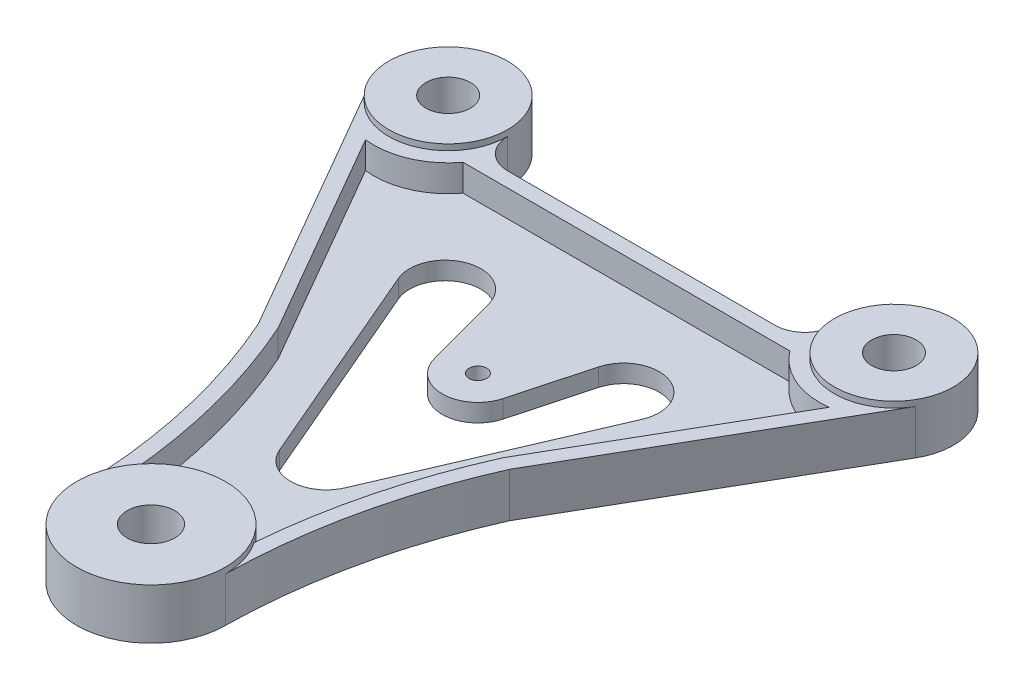
ISO-10303-21;
HEADER;
FILE_DESCRIPTION(('STEP AP214'),'2;1');
FILE_NAME('part.step','',(''),(''),'','','');
FILE_SCHEMA(('AUTOMOTIVE_DESIGN { 1 0 10303 214 1 1 1 1 }'));
ENDSEC;
DATA;
#1=APPLICATION_CONTEXT('core data for automotive mechanical design processes');
#2=APPLICATION_PROTOCOL_DEFINITION('international standard','automotive_design',2000,#1);
#3=PRODUCT_CONTEXT('',#1,'mechanical');
#4=PRODUCT('Part','Part','',(#3));
#5=PRODUCT_RELATED_PRODUCT_CATEGORY('part','',(#4));
#6=PRODUCT_DEFINITION_FORMATION('','',#4);
#7=PRODUCT_DEFINITION_CONTEXT('part definition',#1,'design');
#8=PRODUCT_DEFINITION('design','',#6,#7);
#9=PRODUCT_DEFINITION_SHAPE('','',#8);
#10=(LENGTH_UNIT() NAMED_UNIT(*) SI_UNIT(.MILLI.,.METRE.));
#11=(NAMED_UNIT(*) PLANE_ANGLE_UNIT() SI_UNIT($,.RADIAN.));
#12=(NAMED_UNIT(*) SI_UNIT($,.STERADIAN.) SOLID_ANGLE_UNIT());
#13=UNCERTAINTY_MEASURE_WITH_UNIT(LENGTH_MEASURE(1.E-05),#10,'distance_accuracy_value','');
#14=(GEOMETRIC_REPRESENTATION_CONTEXT(3) GLOBAL_UNCERTAINTY_ASSIGNED_CONTEXT((#13)) GLOBAL_UNIT_ASSIGNED_CONTEXT((#10,
#11,#12)) REPRESENTATION_CONTEXT('',''));
#15=CARTESIAN_POINT('',(0.,0.,0.));
#16=DIRECTION('',(0.,0.,1.));
#17=DIRECTION('',(1.,0.,0.));
#18=AXIS2_PLACEMENT_3D('',#15,#16,#17);
#19=CARTESIAN_POINT('',(-75.,17.,-175.));
#20=DIRECTION('',(0.,-1.,0.));
#21=DIRECTION('',(0.,0.,-1.));
#22=AXIS2_PLACEMENT_3D('',#19,#20,#21);
#23=CYLINDRICAL_SURFACE('',#22,20.);
#24=CARTESIAN_POINT('',(-75.,17.,-175.));
#25=DIRECTION('',(0.,1.,0.));
#26=DIRECTION('',(0.,0.,1.));
#27=AXIS2_PLACEMENT_3D('',#24,#25,#26);
#28=CIRCLE('',#27,20.);
#29=CARTESIAN_POINT('',(-75.,17.,-155.));
#30=VERTEX_POINT('',#29);
#31=EDGE_CURVE('E52',#30,#30,#28,.F.);
#32=ORIENTED_EDGE('',*,*,#31,.T.);
#33=EDGE_LOOP('',(#32));
#34=FACE_BOUND('',#33,.T.);
#35=CARTESIAN_POINT('',(-75.,15.,-175.));
#36=DIRECTION('',(0.,1.,0.));
#37=DIRECTION('',(0.,0.,1.));
#38=AXIS2_PLACEMENT_3D('',#35,#36,#37);
#39=CIRCLE('',#38,20.);
#40=CARTESIAN_POINT('',(-55.,15.,-175.));
#41=VERTEX_POINT('',#40);
#42=CARTESIAN_POINT('',(-92.3205080756888,15.,-165.));
#43=VERTEX_POINT('',#42);
#44=EDGE_CURVE('E397',#41,#43,#39,.F.);
#45=ORIENTED_EDGE('',*,*,#44,.F.);
#46=DIRECTION('',(0.,-1.,0.));
#47=VECTOR('',#46,1.);
#48=CARTESIAN_POINT('',(-55.,15.,-175.));
#49=LINE('',#48,#47);
#50=CARTESIAN_POINT('',(-55.,0.,-175.));
#51=VERTEX_POINT('',#50);
#52=EDGE_CURVE('E274',#41,#51,#49,.T.);
#53=ORIENTED_EDGE('',*,*,#52,.T.);
#54=CARTESIAN_POINT('',(-75.,0.,-175.));
#55=DIRECTION('',(0.,1.,0.));
#56=DIRECTION('',(0.,0.,1.));
#57=AXIS2_PLACEMENT_3D('',#54,#55,#56);
#58=CIRCLE('',#57,20.);
#59=CARTESIAN_POINT('',(-92.3205080756888,0.,-165.));
#60=VERTEX_POINT('',#59);
#61=EDGE_CURVE('E278',#60,#51,#58,.F.);
#62=ORIENTED_EDGE('',*,*,#61,.F.);
#63=DIRECTION('',(0.,-1.,0.));
#64=VECTOR('',#63,1.);
#65=CARTESIAN_POINT('',(-92.3205080756888,15.,-165.));
#66=LINE('',#65,#64);
#67=EDGE_CURVE('E271',#43,#60,#66,.T.);
#68=ORIENTED_EDGE('',*,*,#67,.F.);
#69=EDGE_LOOP('',(#45,#53,#62,#68));
#70=FACE_BOUND('',#69,.T.);
#71=ADVANCED_FACE('F43',(#34,#70),#23,.T.);
#72=CARTESIAN_POINT('',(-75.,17.,-175.));
#73=DIRECTION('',(0.,-1.,0.));
#74=DIRECTION('',(0.,0.,-1.));
#75=AXIS2_PLACEMENT_3D('',#72,#73,#74);
#76=CYLINDRICAL_SURFACE('',#75,7.5);
#77=CARTESIAN_POINT('',(-75.,17.,-175.));
#78=DIRECTION('',(0.,1.,0.));
#79=DIRECTION('',(0.,0.,1.));
#80=AXIS2_PLACEMENT_3D('',#77,#78,#79);
#81=CIRCLE('',#80,7.5);
#82=CARTESIAN_POINT('',(-75.,17.,-167.5));
#83=VERTEX_POINT('',#82);
#84=EDGE_CURVE('E11',#83,#83,#81,.F.);
#85=ORIENTED_EDGE('',*,*,#84,.F.);
#86=EDGE_LOOP('',(#85));
#87=FACE_BOUND('',#86,.T.);
#88=CARTESIAN_POINT('',(-75.,0.,-175.));
#89=DIRECTION('',(0.,1.,0.));
#90=DIRECTION('',(0.,0.,1.));
#91=AXIS2_PLACEMENT_3D('',#88,#89,#90);
#92=CIRCLE('',#91,7.5);
#93=CARTESIAN_POINT('',(-75.,0.,-167.5));
#94=VERTEX_POINT('',#93);
#95=EDGE_CURVE('E46',#94,#94,#92,.F.);
#96=ORIENTED_EDGE('',*,*,#95,.T.);
#97=EDGE_LOOP('',(#96));
#98=FACE_BOUND('',#97,.T.);
#99=ADVANCED_FACE('F288',(#87,#98),#76,.F.);
#100=CARTESIAN_POINT('',(0.,17.,0.));
#101=DIRECTION('',(0.,1.,0.));
#102=DIRECTION('',(0.,0.,1.));
#103=AXIS2_PLACEMENT_3D('',#100,#101,#102);
#104=PLANE('',#103);
#105=ORIENTED_EDGE('',*,*,#31,.F.);
#106=EDGE_LOOP('',(#105));
#107=FACE_BOUND('',#106,.T.);
#108=ORIENTED_EDGE('',*,*,#84,.T.);
#109=EDGE_LOOP('',(#108));
#110=FACE_BOUND('',#109,.T.);
#111=ADVANCED_FACE('F294',(#107,#110),#104,.T.);
#112=CARTESIAN_POINT('',(0.,0.,0.));
#113=DIRECTION('',(0.,1.,0.));
#114=DIRECTION('',(0.,0.,1.));
#115=AXIS2_PLACEMENT_3D('',#112,#113,#114);
#116=PLANE('',#115);
#117=CARTESIAN_POINT('',(0.,0.,0.));
#118=DIRECTION('',(0.,1.,0.));
#119=DIRECTION('',(0.,0.,1.));
#120=AXIS2_PLACEMENT_3D('',#117,#118,#119);
#121=CIRCLE('',#120,25.);
#122=CARTESIAN_POINT('',(-25.,0.,-2.94062734232381E-12));
#123=VERTEX_POINT('',#122);
#124=CARTESIAN_POINT('',(25.,0.,-2.94062734232381E-12));
#125=VERTEX_POINT('',#124);
#126=EDGE_CURVE('E370',#123,#125,#121,.T.);
#127=ORIENTED_EDGE('',*,*,#126,.F.);
#128=CARTESIAN_POINT('',(-224.976449544484,0.,3.06914117992598));
#129=DIRECTION('',(0.,1.,0.));
#130=DIRECTION('',(0.,0.,1.));
#131=AXIS2_PLACEMENT_3D('',#128,#129,#130);
#132=CIRCLE('',#131,200.);
#133=CARTESIAN_POINT('',(-42.320508075689,0.,-78.3974596215561));
#134=VERTEX_POINT('',#133);
#135=EDGE_CURVE('E459',#123,#134,#132,.T.);
#136=ORIENTED_EDGE('',*,*,#135,.T.);
#137=DIRECTION('',(0.499999999999998,0.,0.86602540378444));
#138=VECTOR('',#137,1.);
#139=CARTESIAN_POINT('',(2.20671475544918,0.,-1.27404735808329));
#140=LINE('',#139,#138);
#141=EDGE_CURVE('E68',#60,#134,#140,.T.);
#142=ORIENTED_EDGE('',*,*,#141,.F.);
#143=ORIENTED_EDGE('',*,*,#61,.T.);
#144=CARTESIAN_POINT('',(-45.,0.,-175.));
#145=DIRECTION('',(0.,1.,0.));
#146=DIRECTION('',(0.,0.,1.));
#147=AXIS2_PLACEMENT_3D('',#144,#145,#146);
#148=CIRCLE('',#147,10.);
#149=CARTESIAN_POINT('',(-45.,0.,-165.));
#150=VERTEX_POINT('',#149);
#151=EDGE_CURVE('E388',#150,#51,#148,.F.);
#152=ORIENTED_EDGE('',*,*,#151,.F.);
#153=DIRECTION('',(1.,0.,0.));
#154=VECTOR('',#153,1.);
#155=CARTESIAN_POINT('',(0.,0.,-165.));
#156=LINE('',#155,#154);
#157=CARTESIAN_POINT('',(45.,0.,-165.));
#158=VERTEX_POINT('',#157);
#159=EDGE_CURVE('E398',#150,#158,#156,.T.);
#160=ORIENTED_EDGE('',*,*,#159,.T.);
#161=CARTESIAN_POINT('',(45.,0.,-175.));
#162=DIRECTION('',(0.,1.,0.));
#163=DIRECTION('',(0.,0.,1.));
#164=AXIS2_PLACEMENT_3D('',#161,#162,#163);
#165=CIRCLE('',#164,10.);
#166=CARTESIAN_POINT('',(55.,0.,-175.));
#167=VERTEX_POINT('',#166);
#168=EDGE_CURVE('E470',#158,#167,#165,.T.);
#169=ORIENTED_EDGE('',*,*,#168,.T.);
#170=CARTESIAN_POINT('',(75.,0.,-175.));
#171=DIRECTION('',(0.,1.,0.));
#172=DIRECTION('',(0.,0.,1.));
#173=AXIS2_PLACEMENT_3D('',#170,#171,#172);
#174=CIRCLE('',#173,20.);
#175=CARTESIAN_POINT('',(92.3205080756888,0.,-165.));
#176=VERTEX_POINT('',#175);
#177=EDGE_CURVE('E384',#176,#167,#174,.T.);
#178=ORIENTED_EDGE('',*,*,#177,.F.);
#179=DIRECTION('',(-0.499999999999998,0.,0.86602540378444));
#180=VECTOR('',#179,1.);
#181=CARTESIAN_POINT('',(-2.20671475544918,0.,-1.27404735808329));
#182=LINE('',#181,#180);
#183=CARTESIAN_POINT('',(42.320508075689,0.,-78.3974596215561));
#184=VERTEX_POINT('',#183);
#185=EDGE_CURVE('E466',#176,#184,#182,.T.);
#186=ORIENTED_EDGE('',*,*,#185,.T.);
#187=CARTESIAN_POINT('',(224.976449544484,0.,3.06914117992598));
#188=DIRECTION('',(0.,1.,0.));
#189=DIRECTION('',(0.,0.,1.));
#190=AXIS2_PLACEMENT_3D('',#187,#188,#189);
#191=CIRCLE('',#190,200.);
#192=EDGE_CURVE('E462',#125,#184,#191,.F.);
#193=ORIENTED_EDGE('',*,*,#192,.F.);
#194=EDGE_LOOP('',(#127,#136,#142,#143,#152,#160,#169,#178,#186,#193));
#195=FACE_BOUND('',#194,.T.);
#196=ORIENTED_EDGE('',*,*,#95,.F.);
#197=EDGE_LOOP('',(#196));
#198=FACE_BOUND('',#197,.T.);
#199=CARTESIAN_POINT('',(75.,0.,-175.));
#200=DIRECTION('',(0.,1.,0.));
#201=DIRECTION('',(0.,0.,1.));
#202=AXIS2_PLACEMENT_3D('',#199,#200,#201);
#203=CIRCLE('',#202,7.5);
#204=CARTESIAN_POINT('',(75.,0.,-167.5));
#205=VERTEX_POINT('',#204);
#206=EDGE_CURVE('E299',#205,#205,#203,.T.);
#207=ORIENTED_EDGE('',*,*,#206,.T.);
#208=EDGE_LOOP('',(#207));
#209=FACE_BOUND('',#208,.T.);
#210=CARTESIAN_POINT('',(0.,0.,0.));
#211=DIRECTION('',(0.,1.,0.));
#212=DIRECTION('',(0.,0.,1.));
#213=AXIS2_PLACEMENT_3D('',#210,#211,#212);
#214=CIRCLE('',#213,8.);
#215=CARTESIAN_POINT('',(0.,0.,8.));
#216=VERTEX_POINT('',#215);
#217=EDGE_CURVE('E303',#216,#216,#214,.T.);
#218=ORIENTED_EDGE('',*,*,#217,.T.);
#219=EDGE_LOOP('',(#218));
#220=FACE_BOUND('',#219,.T.);
#221=CARTESIAN_POINT('',(0.,0.,-110.));
#222=DIRECTION('',(0.,1.,0.));
#223=DIRECTION('',(0.,0.,1.));
#224=AXIS2_PLACEMENT_3D('',#221,#222,#223);
#225=CIRCLE('',#224,3.);
#226=CARTESIAN_POINT('',(0.,0.,-107.));
#227=VERTEX_POINT('',#226);
#228=EDGE_CURVE('E307',#227,#227,#225,.T.);
#229=ORIENTED_EDGE('',*,*,#228,.T.);
#230=EDGE_LOOP('',(#229));
#231=FACE_BOUND('',#230,.T.);
#232=DIRECTION('',(-0.393919298579168,0.,-0.919145030018058));
#233=VECTOR('',#232,1.);
#234=CARTESIAN_POINT('',(10.3323286053005,0.,-4.42814083084309));
#235=LINE('',#234,#233);
#236=CARTESIAN_POINT('',(-11.0297403602167,0.,-54.27296841705));
#237=VERTEX_POINT('',#236);
#238=CARTESIAN_POINT('',(-41.0297403602167,0.,-124.27296841705));
#239=VERTEX_POINT('',#238);
#240=EDGE_CURVE('E311',#237,#239,#235,.T.);
#241=ORIENTED_EDGE('',*,*,#240,.F.);
#242=CARTESIAN_POINT('',(0.,0.,-59.));
#243=DIRECTION('',(0.,1.,0.));
#244=DIRECTION('',(0.,0.,1.));
#245=AXIS2_PLACEMENT_3D('',#242,#243,#244);
#246=CIRCLE('',#245,12.);
#247=CARTESIAN_POINT('',(11.0297403602167,0.,-54.27296841705));
#248=VERTEX_POINT('',#247);
#249=EDGE_CURVE('E314',#237,#248,#246,.T.);
#250=ORIENTED_EDGE('',*,*,#249,.T.);
#251=DIRECTION('',(0.393919298579168,0.,-0.919145030018058));
#252=VECTOR('',#251,1.);
#253=CARTESIAN_POINT('',(-10.3323286053005,0.,-4.42814083084309));
#254=LINE('',#253,#252);
#255=CARTESIAN_POINT('',(41.0297403602167,0.,-124.27296841705));
#256=VERTEX_POINT('',#255);
#257=EDGE_CURVE('E331',#248,#256,#254,.T.);
#258=ORIENTED_EDGE('',*,*,#257,.T.);
#259=CARTESIAN_POINT('',(30.,0.,-129.));
#260=DIRECTION('',(0.,1.,0.));
#261=DIRECTION('',(0.,0.,1.));
#262=AXIS2_PLACEMENT_3D('',#259,#260,#261);
#263=CIRCLE('',#262,12.);
#264=CARTESIAN_POINT('',(18.4160737020572,0.,-132.132515207278));
#265=VERTEX_POINT('',#264);
#266=EDGE_CURVE('E337',#256,#265,#263,.T.);
#267=ORIENTED_EDGE('',*,*,#266,.T.);
#268=DIRECTION('',(0.261042933939844,0.,-0.965327191495235));
#269=VECTOR('',#268,1.);
#270=CARTESIAN_POINT('',(-16.135176352838,0.,-4.36326026231327));
#271=LINE('',#270,#269);
#272=CARTESIAN_POINT('',(11.5839262979428,0.,-106.867484792722));
#273=VERTEX_POINT('',#272);
#274=EDGE_CURVE('E558',#273,#265,#271,.T.);
#275=ORIENTED_EDGE('',*,*,#274,.F.);
#276=CARTESIAN_POINT('',(0.,0.,-110.));
#277=DIRECTION('',(0.,1.,0.));
#278=DIRECTION('',(0.,0.,1.));
#279=AXIS2_PLACEMENT_3D('',#276,#277,#278);
#280=CIRCLE('',#279,12.);
#281=CARTESIAN_POINT('',(-11.5839262979428,0.,-106.867484792722));
#282=VERTEX_POINT('',#281);
#283=EDGE_CURVE('E555',#282,#273,#280,.T.);
#284=ORIENTED_EDGE('',*,*,#283,.F.);
#285=DIRECTION('',(-0.261042933939844,0.,-0.965327191495235));
#286=VECTOR('',#285,1.);
#287=CARTESIAN_POINT('',(16.135176352838,0.,-4.36326026231327));
#288=LINE('',#287,#286);
#289=CARTESIAN_POINT('',(-18.4160737020572,0.,-132.132515207278));
#290=VERTEX_POINT('',#289);
#291=EDGE_CURVE('E552',#282,#290,#288,.T.);
#292=ORIENTED_EDGE('',*,*,#291,.T.);
#293=CARTESIAN_POINT('',(-30.,0.,-129.));
#294=DIRECTION('',(0.,1.,0.));
#295=DIRECTION('',(0.,0.,1.));
#296=AXIS2_PLACEMENT_3D('',#293,#294,#295);
#297=CIRCLE('',#296,12.);
#298=EDGE_CURVE('E317',#239,#290,#297,.F.);
#299=ORIENTED_EDGE('',*,*,#298,.F.);
#300=EDGE_LOOP('',(#241,#250,#258,#267,#275,#284,#292,#299));
#301=FACE_BOUND('',#300,.T.);
#302=ADVANCED_FACE('F290',(#195,#198,#209,#220,#231,#301),#116,.F.);
#303=CARTESIAN_POINT('',(-45.,15.,-175.));
#304=DIRECTION('',(0.,-1.,0.));
#305=DIRECTION('',(0.,0.,-1.));
#306=AXIS2_PLACEMENT_3D('',#303,#304,#305);
#307=CYLINDRICAL_SURFACE('',#306,10.);
#308=ORIENTED_EDGE('',*,*,#151,.T.);
#309=ORIENTED_EDGE('',*,*,#52,.F.);
#310=CARTESIAN_POINT('',(-45.,15.,-175.));
#311=DIRECTION('',(0.,1.,0.));
#312=DIRECTION('',(0.,0.,1.));
#313=AXIS2_PLACEMENT_3D('',#310,#311,#312);
#314=CIRCLE('',#313,10.);
#315=CARTESIAN_POINT('',(-45.,15.,-165.));
#316=VERTEX_POINT('',#315);
#317=EDGE_CURVE('E394',#316,#41,#314,.F.);
#318=ORIENTED_EDGE('',*,*,#317,.F.);
#319=DIRECTION('',(0.,-1.,0.));
#320=VECTOR('',#319,1.);
#321=CARTESIAN_POINT('',(-45.,15.,-165.));
#322=LINE('',#321,#320);
#323=EDGE_CURVE('E454',#316,#150,#322,.T.);
#324=ORIENTED_EDGE('',*,*,#323,.T.);
#325=EDGE_LOOP('',(#308,#309,#318,#324));
#326=FACE_BOUND('',#325,.T.);
#327=ADVANCED_FACE('F293',(#326),#307,.F.);
#328=CARTESIAN_POINT('',(2.20671475544918,15.,-1.27404735808329));
#329=DIRECTION('',(0.86602540378444,0.,-0.499999999999998));
#330=DIRECTION('',(-0.499999999999998,0.,-0.86602540378444));
#331=AXIS2_PLACEMENT_3D('',#328,#329,#330);
#332=PLANE('',#331);
#333=ORIENTED_EDGE('',*,*,#141,.T.);
#334=DIRECTION('',(0.,-1.,0.));
#335=VECTOR('',#334,1.);
#336=CARTESIAN_POINT('',(-42.320508075689,15.,-78.3974596215561));
#337=LINE('',#336,#335);
#338=CARTESIAN_POINT('',(-42.320508075689,15.,-78.3974596215561));
#339=VERTEX_POINT('',#338);
#340=EDGE_CURVE('E268',#339,#134,#337,.T.);
#341=ORIENTED_EDGE('',*,*,#340,.F.);
#342=DIRECTION('',(0.499999999999998,0.,0.86602540378444));
#343=VECTOR('',#342,1.);
#344=CARTESIAN_POINT('',(2.20671475544918,15.,-1.27404735808329));
#345=LINE('',#344,#343);
#346=EDGE_CURVE('E401',#43,#339,#345,.T.);
#347=ORIENTED_EDGE('',*,*,#346,.F.);
#348=ORIENTED_EDGE('',*,*,#67,.T.);
#349=EDGE_LOOP('',(#333,#341,#347,#348));
#350=FACE_BOUND('',#349,.T.);
#351=ADVANCED_FACE('F618',(#350),#332,.F.);
#352=CARTESIAN_POINT('',(-224.976449544484,15.,3.06914117992598));
#353=DIRECTION('',(0.,-1.,0.));
#354=DIRECTION('',(0.,0.,-1.));
#355=AXIS2_PLACEMENT_3D('',#352,#353,#354);
#356=CYLINDRICAL_SURFACE('',#355,200.);
#357=ORIENTED_EDGE('',*,*,#135,.F.);
#358=DIRECTION('',(0.,-1.,0.));
#359=VECTOR('',#358,1.);
#360=CARTESIAN_POINT('',(-25.,15.,-2.94062734232381E-12));
#361=LINE('',#360,#359);
#362=CARTESIAN_POINT('',(-24.9999999999999,15.,6.27926530216705E-12));
#363=VERTEX_POINT('',#362);
#364=EDGE_CURVE('E264',#363,#123,#361,.T.);
#365=ORIENTED_EDGE('',*,*,#364,.F.);
#366=CARTESIAN_POINT('',(-224.976449544484,15.,3.06914117992598));
#367=DIRECTION('',(0.,1.,0.));
#368=DIRECTION('',(0.,0.,1.));
#369=AXIS2_PLACEMENT_3D('',#366,#367,#368);
#370=CIRCLE('',#369,200.);
#371=EDGE_CURVE('E404',#363,#339,#370,.T.);
#372=ORIENTED_EDGE('',*,*,#371,.T.);
#373=ORIENTED_EDGE('',*,*,#340,.T.);
#374=EDGE_LOOP('',(#357,#365,#372,#373));
#375=FACE_BOUND('',#374,.T.);
#376=ADVANCED_FACE('F621',(#375),#356,.F.);
#377=CARTESIAN_POINT('',(-224.976449544484,15.,3.06914117992598));
#378=DIRECTION('',(0.,-1.,0.));
#379=DIRECTION('',(0.,0.,-1.));
#380=AXIS2_PLACEMENT_3D('',#377,#378,#379);
#381=CYLINDRICAL_SURFACE('',#380,205.);
#382=DIRECTION('',(0.,-1.,0.));
#383=VECTOR('',#382,1.);
#384=CARTESIAN_POINT('',(-20.6909482523352,15.,-14.0315594435967));
#385=LINE('',#384,#383);
#386=CARTESIAN_POINT('',(-20.6909482523352,15.,-14.0315594435967));
#387=VERTEX_POINT('',#386);
#388=CARTESIAN_POINT('',(-20.6909482523352,6.,-14.0315594435967));
#389=VERTEX_POINT('',#388);
#390=EDGE_CURVE('E260',#387,#389,#385,.T.);
#391=ORIENTED_EDGE('',*,*,#390,.T.);
#392=CARTESIAN_POINT('',(-224.976449544484,6.,3.06914117992598));
#393=DIRECTION('',(0.,1.,0.));
#394=DIRECTION('',(0.,0.,1.));
#395=AXIS2_PLACEMENT_3D('',#392,#393,#394);
#396=CIRCLE('',#395,205.);
#397=CARTESIAN_POINT('',(-37.8609858470479,6.,-80.6733405440673));
#398=VERTEX_POINT('',#397);
#399=EDGE_CURVE('E60',#389,#398,#396,.T.);
#400=ORIENTED_EDGE('',*,*,#399,.T.);
#401=DIRECTION('',(0.,-1.,0.));
#402=VECTOR('',#401,1.);
#403=CARTESIAN_POINT('',(-37.8609858470479,15.,-80.6733405440673));
#404=LINE('',#403,#402);
#405=CARTESIAN_POINT('',(-37.8609858470479,15.,-80.6733405440673));
#406=VERTEX_POINT('',#405);
#407=EDGE_CURVE('E251',#406,#398,#404,.T.);
#408=ORIENTED_EDGE('',*,*,#407,.F.);
#409=CARTESIAN_POINT('',(-224.976449544484,15.,3.06914117992598));
#410=DIRECTION('',(0.,1.,0.));
#411=DIRECTION('',(0.,0.,1.));
#412=AXIS2_PLACEMENT_3D('',#409,#410,#411);
#413=CIRCLE('',#412,205.);
#414=EDGE_CURVE('E412',#387,#406,#413,.T.);
#415=ORIENTED_EDGE('',*,*,#414,.F.);
#416=EDGE_LOOP('',(#391,#400,#408,#415));
#417=FACE_BOUND('',#416,.T.);
#418=ADVANCED_FACE('F631',(#417),#381,.T.);
#419=CARTESIAN_POINT('',(6.53684177437186,15.,-3.77404735808359));
#420=DIRECTION('',(0.866025403784438,0.,-0.5));
#421=DIRECTION('',(-0.5,0.,-0.866025403784438));
#422=AXIS2_PLACEMENT_3D('',#419,#420,#421);
#423=PLANE('',#422);
#424=DIRECTION('',(0.5,0.,0.866025403784438));
#425=VECTOR('',#424,1.);
#426=CARTESIAN_POINT('',(6.53684177437186,6.,-3.77404735808359));
#427=LINE('',#426,#425);
#428=CARTESIAN_POINT('',(-77.9903810567666,6.,-150.179491924311));
#429=VERTEX_POINT('',#428);
#430=EDGE_CURVE('E241',#429,#398,#427,.T.);
#431=ORIENTED_EDGE('',*,*,#430,.F.);
#432=DIRECTION('',(0.,-1.,0.));
#433=VECTOR('',#432,1.);
#434=CARTESIAN_POINT('',(-77.9903810567666,15.,-150.179491924311));
#435=LINE('',#434,#433);
#436=CARTESIAN_POINT('',(-77.9903810567666,15.,-150.179491924311));
#437=VERTEX_POINT('',#436);
#438=EDGE_CURVE('E239',#437,#429,#435,.T.);
#439=ORIENTED_EDGE('',*,*,#438,.F.);
#440=DIRECTION('',(0.5,0.,0.866025403784438));
#441=VECTOR('',#440,1.);
#442=CARTESIAN_POINT('',(6.53684177437186,15.,-3.77404735808359));
#443=LINE('',#442,#441);
#444=EDGE_CURVE('E416',#437,#406,#443,.T.);
#445=ORIENTED_EDGE('',*,*,#444,.T.);
#446=ORIENTED_EDGE('',*,*,#407,.T.);
#447=EDGE_LOOP('',(#431,#439,#445,#446));
#448=FACE_BOUND('',#447,.T.);
#449=ADVANCED_FACE('F633',(#448),#423,.T.);
#450=CARTESIAN_POINT('',(-75.,15.,-175.));
#451=DIRECTION('',(0.,-1.,0.));
#452=DIRECTION('',(0.,0.,-1.));
#453=AXIS2_PLACEMENT_3D('',#450,#451,#452);
#454=CYLINDRICAL_SURFACE('',#453,25.);
#455=CARTESIAN_POINT('',(-75.,6.,-175.));
#456=DIRECTION('',(0.,1.,0.));
#457=DIRECTION('',(0.,0.,1.));
#458=AXIS2_PLACEMENT_3D('',#455,#456,#457);
#459=CIRCLE('',#458,25.);
#460=CARTESIAN_POINT('',(-55.,6.,-160.));
#461=VERTEX_POINT('',#460);
#462=EDGE_CURVE('E222',#461,#429,#459,.F.);
#463=ORIENTED_EDGE('',*,*,#462,.F.);
#464=DIRECTION('',(0.,-1.,0.));
#465=VECTOR('',#464,1.);
#466=CARTESIAN_POINT('',(-55.,15.,-160.));
#467=LINE('',#466,#465);
#468=CARTESIAN_POINT('',(-55.,15.,-160.));
#469=VERTEX_POINT('',#468);
#470=EDGE_CURVE('E237',#469,#461,#467,.T.);
#471=ORIENTED_EDGE('',*,*,#470,.F.);
#472=CARTESIAN_POINT('',(-75.,15.,-175.));
#473=DIRECTION('',(0.,1.,0.));
#474=DIRECTION('',(0.,0.,1.));
#475=AXIS2_PLACEMENT_3D('',#472,#473,#474);
#476=CIRCLE('',#475,25.);
#477=EDGE_CURVE('E420',#469,#437,#476,.F.);
#478=ORIENTED_EDGE('',*,*,#477,.T.);
#479=ORIENTED_EDGE('',*,*,#438,.T.);
#480=EDGE_LOOP('',(#463,#471,#478,#479));
#481=FACE_BOUND('',#480,.T.);
#482=ADVANCED_FACE('F235',(#481),#454,.T.);
#483=CARTESIAN_POINT('',(0.,15.,-160.));
#484=DIRECTION('',(0.,0.,-1.));
#485=DIRECTION('',(-1.,0.,0.));
#486=AXIS2_PLACEMENT_3D('',#483,#484,#485);
#487=PLANE('',#486);
#488=ORIENTED_EDGE('',*,*,#470,.T.);
#489=DIRECTION('',(1.,0.,0.));
#490=VECTOR('',#489,1.);
#491=CARTESIAN_POINT('',(0.,6.,-160.));
#492=LINE('',#491,#490);
#493=CARTESIAN_POINT('',(55.,6.,-160.));
#494=VERTEX_POINT('',#493);
#495=EDGE_CURVE('E218',#461,#494,#492,.T.);
#496=ORIENTED_EDGE('',*,*,#495,.T.);
#497=DIRECTION('',(0.,-1.,0.));
#498=VECTOR('',#497,1.);
#499=CARTESIAN_POINT('',(55.,15.,-160.));
#500=LINE('',#499,#498);
#501=CARTESIAN_POINT('',(55.,15.,-160.));
#502=VERTEX_POINT('',#501);
#503=EDGE_CURVE('E247',#502,#494,#500,.T.);
#504=ORIENTED_EDGE('',*,*,#503,.F.);
#505=DIRECTION('',(1.,0.,0.));
#506=VECTOR('',#505,1.);
#507=CARTESIAN_POINT('',(0.,15.,-160.));
#508=LINE('',#507,#506);
#509=EDGE_CURVE('E244',#469,#502,#508,.T.);
#510=ORIENTED_EDGE('',*,*,#509,.F.);
#511=EDGE_LOOP('',(#488,#496,#504,#510));
#512=FACE_BOUND('',#511,.T.);
#513=ADVANCED_FACE('F243',(#512),#487,.F.);
#514=CARTESIAN_POINT('',(75.,15.,-175.));
#515=DIRECTION('',(0.,-1.,0.));
#516=DIRECTION('',(0.,0.,-1.));
#517=AXIS2_PLACEMENT_3D('',#514,#515,#516);
#518=CYLINDRICAL_SURFACE('',#517,25.);
#519=ORIENTED_EDGE('',*,*,#503,.T.);
#520=CARTESIAN_POINT('',(75.,6.,-175.));
#521=DIRECTION('',(0.,1.,0.));
#522=DIRECTION('',(0.,0.,1.));
#523=AXIS2_PLACEMENT_3D('',#520,#521,#522);
#524=CIRCLE('',#523,25.);
#525=CARTESIAN_POINT('',(77.9903810567666,6.,-150.179491924311));
#526=VERTEX_POINT('',#525);
#527=EDGE_CURVE('E225',#494,#526,#524,.T.);
#528=ORIENTED_EDGE('',*,*,#527,.T.);
#529=DIRECTION('',(0.,-1.,0.));
#530=VECTOR('',#529,1.);
#531=CARTESIAN_POINT('',(77.9903810567666,15.,-150.179491924311));
#532=LINE('',#531,#530);
#533=CARTESIAN_POINT('',(77.9903810567666,15.,-150.179491924311));
#534=VERTEX_POINT('',#533);
#535=EDGE_CURVE('E253',#534,#526,#532,.T.);
#536=ORIENTED_EDGE('',*,*,#535,.F.);
#537=CARTESIAN_POINT('',(75.,15.,-175.));
#538=DIRECTION('',(0.,1.,0.));
#539=DIRECTION('',(0.,0.,1.));
#540=AXIS2_PLACEMENT_3D('',#537,#538,#539);
#541=CIRCLE('',#540,25.);
#542=EDGE_CURVE('E425',#502,#534,#541,.T.);
#543=ORIENTED_EDGE('',*,*,#542,.F.);
#544=EDGE_LOOP('',(#519,#528,#536,#543));
#545=FACE_BOUND('',#544,.T.);
#546=ADVANCED_FACE('F513',(#545),#518,.T.);
#547=CARTESIAN_POINT('',(-6.53684177437186,15.,-3.77404735808359));
#548=DIRECTION('',(0.866025403784438,0.,0.5));
#549=DIRECTION('',(0.5,0.,-0.866025403784438));
#550=AXIS2_PLACEMENT_3D('',#547,#548,#549);
#551=PLANE('',#550);
#552=ORIENTED_EDGE('',*,*,#535,.T.);
#553=DIRECTION('',(-0.5,0.,0.866025403784438));
#554=VECTOR('',#553,1.);
#555=CARTESIAN_POINT('',(-6.53684177437186,6.,-3.77404735808359));
#556=LINE('',#555,#554);
#557=CARTESIAN_POINT('',(37.8609858470479,6.,-80.6733405440673));
#558=VERTEX_POINT('',#557);
#559=EDGE_CURVE('E510',#526,#558,#556,.T.);
#560=ORIENTED_EDGE('',*,*,#559,.T.);
#561=DIRECTION('',(0.,-1.,0.));
#562=VECTOR('',#561,1.);
#563=CARTESIAN_POINT('',(37.8609858470479,15.,-80.6733405440673));
#564=LINE('',#563,#562);
#565=CARTESIAN_POINT('',(37.8609858470479,15.,-80.6733405440673));
#566=VERTEX_POINT('',#565);
#567=EDGE_CURVE('E499',#566,#558,#564,.T.);
#568=ORIENTED_EDGE('',*,*,#567,.F.);
#569=DIRECTION('',(-0.5,0.,0.866025403784438));
#570=VECTOR('',#569,1.);
#571=CARTESIAN_POINT('',(-6.53684177437186,15.,-3.77404735808359));
#572=LINE('',#571,#570);
#573=EDGE_CURVE('E428',#534,#566,#572,.T.);
#574=ORIENTED_EDGE('',*,*,#573,.F.);
#575=EDGE_LOOP('',(#552,#560,#568,#574));
#576=FACE_BOUND('',#575,.T.);
#577=ADVANCED_FACE('F508',(#576),#551,.F.);
#578=CARTESIAN_POINT('',(224.976449544484,15.,3.06914117992598));
#579=DIRECTION('',(0.,-1.,0.));
#580=DIRECTION('',(0.,0.,-1.));
#581=AXIS2_PLACEMENT_3D('',#578,#579,#580);
#582=CYLINDRICAL_SURFACE('',#581,205.);
#583=CARTESIAN_POINT('',(224.976449544484,6.,3.06914117992598));
#584=DIRECTION('',(0.,1.,0.));
#585=DIRECTION('',(0.,0.,1.));
#586=AXIS2_PLACEMENT_3D('',#583,#584,#585);
#587=CIRCLE('',#586,205.);
#588=CARTESIAN_POINT('',(20.6909482523352,6.,-14.0315594435967));
#589=VERTEX_POINT('',#588);
#590=EDGE_CURVE('E522',#589,#558,#587,.F.);
#591=ORIENTED_EDGE('',*,*,#590,.F.);
#592=DIRECTION('',(0.,-1.,0.));
#593=VECTOR('',#592,1.);
#594=CARTESIAN_POINT('',(20.6909482523352,15.,-14.0315594435967));
#595=LINE('',#594,#593);
#596=CARTESIAN_POINT('',(20.6909482523352,15.,-14.0315594435969));
#597=VERTEX_POINT('',#596);
#598=EDGE_CURVE('E495',#597,#589,#595,.T.);
#599=ORIENTED_EDGE('',*,*,#598,.F.);
#600=CARTESIAN_POINT('',(224.976449544484,15.,3.06914117992598));
#601=DIRECTION('',(0.,1.,0.));
#602=DIRECTION('',(0.,0.,1.));
#603=AXIS2_PLACEMENT_3D('',#600,#601,#602);
#604=CIRCLE('',#603,205.);
#605=EDGE_CURVE('E431',#597,#566,#604,.F.);
#606=ORIENTED_EDGE('',*,*,#605,.T.);
#607=ORIENTED_EDGE('',*,*,#567,.T.);
#608=EDGE_LOOP('',(#591,#599,#606,#607));
#609=FACE_BOUND('',#608,.T.);
#610=ADVANCED_FACE('F638',(#609),#582,.T.);
#611=CARTESIAN_POINT('',(224.976449544484,15.,3.06914117992598));
#612=DIRECTION('',(0.,-1.,0.));
#613=DIRECTION('',(0.,0.,-1.));
#614=AXIS2_PLACEMENT_3D('',#611,#612,#613);
#615=CYLINDRICAL_SURFACE('',#614,200.);
#616=ORIENTED_EDGE('',*,*,#192,.T.);
#617=DIRECTION('',(0.,-1.,0.));
#618=VECTOR('',#617,1.);
#619=CARTESIAN_POINT('',(42.320508075689,15.,-78.3974596215561));
#620=LINE('',#619,#618);
#621=CARTESIAN_POINT('',(42.320508075689,15.,-78.3974596215561));
#622=VERTEX_POINT('',#621);
#623=EDGE_CURVE('E489',#622,#184,#620,.T.);
#624=ORIENTED_EDGE('',*,*,#623,.F.);
#625=CARTESIAN_POINT('',(224.976449544484,15.,3.06914117992598));
#626=DIRECTION('',(0.,1.,0.));
#627=DIRECTION('',(0.,0.,1.));
#628=AXIS2_PLACEMENT_3D('',#625,#626,#627);
#629=CIRCLE('',#628,200.);
#630=CARTESIAN_POINT('',(25.,15.,-2.94062734232381E-12));
#631=VERTEX_POINT('',#630);
#632=EDGE_CURVE('E435',#631,#622,#629,.F.);
#633=ORIENTED_EDGE('',*,*,#632,.F.);
#634=DIRECTION('',(0.,-1.,0.));
#635=VECTOR('',#634,1.);
#636=CARTESIAN_POINT('',(25.,15.,-2.94062734232381E-12));
#637=LINE('',#636,#635);
#638=EDGE_CURVE('E492',#631,#125,#637,.T.);
#639=ORIENTED_EDGE('',*,*,#638,.T.);
#640=EDGE_LOOP('',(#616,#624,#633,#639));
#641=FACE_BOUND('',#640,.T.);
#642=ADVANCED_FACE('F645',(#641),#615,.F.);
#643=CARTESIAN_POINT('',(-2.20671475544918,15.,-1.27404735808329));
#644=DIRECTION('',(0.86602540378444,0.,0.499999999999998));
#645=DIRECTION('',(0.499999999999998,0.,-0.86602540378444));
#646=AXIS2_PLACEMENT_3D('',#643,#644,#645);
#647=PLANE('',#646);
#648=ORIENTED_EDGE('',*,*,#185,.F.);
#649=DIRECTION('',(0.,-1.,0.));
#650=VECTOR('',#649,1.);
#651=CARTESIAN_POINT('',(92.3205080756888,15.,-165.));
#652=LINE('',#651,#650);
#653=CARTESIAN_POINT('',(92.3205080756888,15.,-165.));
#654=VERTEX_POINT('',#653);
#655=EDGE_CURVE('E485',#654,#176,#652,.T.);
#656=ORIENTED_EDGE('',*,*,#655,.F.);
#657=DIRECTION('',(-0.499999999999998,0.,0.86602540378444));
#658=VECTOR('',#657,1.);
#659=CARTESIAN_POINT('',(-2.20671475544918,15.,-1.27404735808329));
#660=LINE('',#659,#658);
#661=EDGE_CURVE('E438',#654,#622,#660,.T.);
#662=ORIENTED_EDGE('',*,*,#661,.T.);
#663=ORIENTED_EDGE('',*,*,#623,.T.);
#664=EDGE_LOOP('',(#648,#656,#662,#663));
#665=FACE_BOUND('',#664,.T.);
#666=ADVANCED_FACE('F648',(#665),#647,.T.);
#667=CARTESIAN_POINT('',(45.,15.,-175.));
#668=DIRECTION('',(0.,-1.,0.));
#669=DIRECTION('',(0.,0.,-1.));
#670=AXIS2_PLACEMENT_3D('',#667,#668,#669);
#671=CYLINDRICAL_SURFACE('',#670,10.);
#672=ORIENTED_EDGE('',*,*,#168,.F.);
#673=DIRECTION('',(0.,-1.,0.));
#674=VECTOR('',#673,1.);
#675=CARTESIAN_POINT('',(45.,15.,-165.));
#676=LINE('',#675,#674);
#677=CARTESIAN_POINT('',(45.,15.,-165.));
#678=VERTEX_POINT('',#677);
#679=EDGE_CURVE('E479',#678,#158,#676,.T.);
#680=ORIENTED_EDGE('',*,*,#679,.F.);
#681=CARTESIAN_POINT('',(45.,15.,-175.));
#682=DIRECTION('',(0.,1.,0.));
#683=DIRECTION('',(0.,0.,1.));
#684=AXIS2_PLACEMENT_3D('',#681,#682,#683);
#685=CIRCLE('',#684,10.);
#686=CARTESIAN_POINT('',(55.,15.,-175.));
#687=VERTEX_POINT('',#686);
#688=EDGE_CURVE('E446',#678,#687,#685,.T.);
#689=ORIENTED_EDGE('',*,*,#688,.T.);
#690=DIRECTION('',(0.,-1.,0.));
#691=VECTOR('',#690,1.);
#692=CARTESIAN_POINT('',(55.,15.,-175.));
#693=LINE('',#692,#691);
#694=EDGE_CURVE('E482',#687,#167,#693,.T.);
#695=ORIENTED_EDGE('',*,*,#694,.T.);
#696=EDGE_LOOP('',(#672,#680,#689,#695));
#697=FACE_BOUND('',#696,.T.);
#698=ADVANCED_FACE('F657',(#697),#671,.F.);
#699=CARTESIAN_POINT('',(0.,15.,-165.));
#700=DIRECTION('',(0.,0.,-1.));
#701=DIRECTION('',(-1.,0.,0.));
#702=AXIS2_PLACEMENT_3D('',#699,#700,#701);
#703=PLANE('',#702);
#704=ORIENTED_EDGE('',*,*,#159,.F.);
#705=ORIENTED_EDGE('',*,*,#323,.F.);
#706=DIRECTION('',(1.,0.,0.));
#707=VECTOR('',#706,1.);
#708=CARTESIAN_POINT('',(0.,15.,-165.));
#709=LINE('',#708,#707);
#710=EDGE_CURVE('E450',#316,#678,#709,.T.);
#711=ORIENTED_EDGE('',*,*,#710,.T.);
#712=ORIENTED_EDGE('',*,*,#679,.T.);
#713=EDGE_LOOP('',(#704,#705,#711,#712));
#714=FACE_BOUND('',#713,.T.);
#715=ADVANCED_FACE('F660',(#714),#703,.T.);
#716=CARTESIAN_POINT('',(0.,15.,0.));
#717=DIRECTION('',(0.,1.,0.));
#718=DIRECTION('',(0.,0.,1.));
#719=AXIS2_PLACEMENT_3D('',#716,#717,#718);
#720=PLANE('',#719);
#721=ORIENTED_EDGE('',*,*,#317,.T.);
#722=ORIENTED_EDGE('',*,*,#44,.T.);
#723=ORIENTED_EDGE('',*,*,#346,.T.);
#724=ORIENTED_EDGE('',*,*,#371,.F.);
#725=CARTESIAN_POINT('',(0.,15.,0.));
#726=DIRECTION('',(0.,1.,0.));
#727=DIRECTION('',(0.,0.,1.));
#728=AXIS2_PLACEMENT_3D('',#725,#726,#727);
#729=CIRCLE('',#728,25.);
#730=EDGE_CURVE('E408',#387,#363,#729,.T.);
#731=ORIENTED_EDGE('',*,*,#730,.F.);
#732=ORIENTED_EDGE('',*,*,#414,.T.);
#733=ORIENTED_EDGE('',*,*,#444,.F.);
#734=ORIENTED_EDGE('',*,*,#477,.F.);
#735=ORIENTED_EDGE('',*,*,#509,.T.);
#736=ORIENTED_EDGE('',*,*,#542,.T.);
#737=ORIENTED_EDGE('',*,*,#573,.T.);
#738=ORIENTED_EDGE('',*,*,#605,.F.);
#739=EDGE_CURVE('E413',#631,#597,#729,.T.);
#740=ORIENTED_EDGE('',*,*,#739,.F.);
#741=ORIENTED_EDGE('',*,*,#632,.T.);
#742=ORIENTED_EDGE('',*,*,#661,.F.);
#743=CARTESIAN_POINT('',(75.,15.,-175.));
#744=DIRECTION('',(0.,1.,0.));
#745=DIRECTION('',(0.,0.,1.));
#746=AXIS2_PLACEMENT_3D('',#743,#744,#745);
#747=CIRCLE('',#746,20.);
#748=EDGE_CURVE('E442',#687,#654,#747,.T.);
#749=ORIENTED_EDGE('',*,*,#748,.F.);
#750=ORIENTED_EDGE('',*,*,#688,.F.);
#751=ORIENTED_EDGE('',*,*,#710,.F.);
#752=EDGE_LOOP('',(#721,#722,#723,#724,#731,#732,#733,#734,#735,#736,#737,#738,#740,#741,#742,
#749,#750,#751));
#753=FACE_BOUND('',#752,.T.);
#754=ADVANCED_FACE('F613',(#753),#720,.T.);
#755=CARTESIAN_POINT('',(75.,17.,-175.));
#756=DIRECTION('',(0.,-1.,0.));
#757=DIRECTION('',(0.,0.,-1.));
#758=AXIS2_PLACEMENT_3D('',#755,#756,#757);
#759=CYLINDRICAL_SURFACE('',#758,7.5);
#760=CARTESIAN_POINT('',(75.,17.,-175.));
#761=DIRECTION('',(0.,1.,0.));
#762=DIRECTION('',(0.,0.,1.));
#763=AXIS2_PLACEMENT_3D('',#760,#761,#762);
#764=CIRCLE('',#763,7.5);
#765=CARTESIAN_POINT('',(75.,17.,-167.5));
#766=VERTEX_POINT('',#765);
#767=EDGE_CURVE('E379',#766,#766,#764,.T.);
#768=ORIENTED_EDGE('',*,*,#767,.T.);
#769=EDGE_LOOP('',(#768));
#770=FACE_BOUND('',#769,.T.);
#771=ORIENTED_EDGE('',*,*,#206,.F.);
#772=EDGE_LOOP('',(#771));
#773=FACE_BOUND('',#772,.T.);
#774=ADVANCED_FACE('F801',(#770,#773),#759,.F.);
#775=CARTESIAN_POINT('',(75.,17.,-175.));
#776=DIRECTION('',(0.,-1.,0.));
#777=DIRECTION('',(0.,0.,-1.));
#778=AXIS2_PLACEMENT_3D('',#775,#776,#777);
#779=CYLINDRICAL_SURFACE('',#778,20.);
#780=ORIENTED_EDGE('',*,*,#655,.T.);
#781=ORIENTED_EDGE('',*,*,#177,.T.);
#782=ORIENTED_EDGE('',*,*,#694,.F.);
#783=ORIENTED_EDGE('',*,*,#748,.T.);
#784=EDGE_LOOP('',(#780,#781,#782,#783));
#785=FACE_BOUND('',#784,.T.);
#786=CARTESIAN_POINT('',(75.,17.,-175.));
#787=DIRECTION('',(0.,1.,0.));
#788=DIRECTION('',(0.,0.,1.));
#789=AXIS2_PLACEMENT_3D('',#786,#787,#788);
#790=CIRCLE('',#789,20.);
#791=CARTESIAN_POINT('',(75.,17.,-155.));
#792=VERTEX_POINT('',#791);
#793=EDGE_CURVE('E383',#792,#792,#790,.T.);
#794=ORIENTED_EDGE('',*,*,#793,.F.);
#795=EDGE_LOOP('',(#794));
#796=FACE_BOUND('',#795,.T.);
#797=ADVANCED_FACE('F652',(#785,#796),#779,.T.);
#798=CARTESIAN_POINT('',(0.,17.,0.));
#799=DIRECTION('',(0.,1.,0.));
#800=DIRECTION('',(0.,0.,1.));
#801=AXIS2_PLACEMENT_3D('',#798,#799,#800);
#802=PLANE('',#801);
#803=ORIENTED_EDGE('',*,*,#767,.F.);
#804=EDGE_LOOP('',(#803));
#805=FACE_BOUND('',#804,.T.);
#806=ORIENTED_EDGE('',*,*,#793,.T.);
#807=EDGE_LOOP('',(#806));
#808=FACE_BOUND('',#807,.T.);
#809=ADVANCED_FACE('F885',(#805,#808),#802,.T.);
#810=CARTESIAN_POINT('',(0.,17.,0.));
#811=DIRECTION('',(0.,-1.,0.));
#812=DIRECTION('',(0.,0.,-1.));
#813=AXIS2_PLACEMENT_3D('',#810,#811,#812);
#814=CYLINDRICAL_SURFACE('',#813,8.);
#815=CARTESIAN_POINT('',(0.,17.,0.));
#816=DIRECTION('',(0.,1.,0.));
#817=DIRECTION('',(0.,0.,1.));
#818=AXIS2_PLACEMENT_3D('',#815,#816,#817);
#819=CIRCLE('',#818,8.);
#820=CARTESIAN_POINT('',(0.,17.,8.));
#821=VERTEX_POINT('',#820);
#822=EDGE_CURVE('E365',#821,#821,#819,.T.);
#823=ORIENTED_EDGE('',*,*,#822,.T.);
#824=EDGE_LOOP('',(#823));
#825=FACE_BOUND('',#824,.T.);
#826=ORIENTED_EDGE('',*,*,#217,.F.);
#827=EDGE_LOOP('',(#826));
#828=FACE_BOUND('',#827,.T.);
#829=ADVANCED_FACE('F698',(#825,#828),#814,.F.);
#830=CARTESIAN_POINT('',(0.,17.,0.));
#831=DIRECTION('',(0.,-1.,0.));
#832=DIRECTION('',(0.,0.,-1.));
#833=AXIS2_PLACEMENT_3D('',#830,#831,#832);
#834=CYLINDRICAL_SURFACE('',#833,25.);
#835=ORIENTED_EDGE('',*,*,#598,.T.);
#836=CARTESIAN_POINT('',(0.,6.,0.));
#837=DIRECTION('',(0.,1.,0.));
#838=DIRECTION('',(0.,0.,1.));
#839=AXIS2_PLACEMENT_3D('',#836,#837,#838);
#840=CIRCLE('',#839,25.);
#841=EDGE_CURVE('E629',#589,#389,#840,.T.);
#842=ORIENTED_EDGE('',*,*,#841,.T.);
#843=ORIENTED_EDGE('',*,*,#390,.F.);
#844=ORIENTED_EDGE('',*,*,#730,.T.);
#845=ORIENTED_EDGE('',*,*,#364,.T.);
#846=ORIENTED_EDGE('',*,*,#126,.T.);
#847=ORIENTED_EDGE('',*,*,#638,.F.);
#848=ORIENTED_EDGE('',*,*,#739,.T.);
#849=EDGE_LOOP('',(#835,#842,#843,#844,#845,#846,#847,#848));
#850=FACE_BOUND('',#849,.T.);
#851=CARTESIAN_POINT('',(0.,17.,0.));
#852=DIRECTION('',(0.,1.,0.));
#853=DIRECTION('',(0.,0.,1.));
#854=AXIS2_PLACEMENT_3D('',#851,#852,#853);
#855=CIRCLE('',#854,25.);
#856=CARTESIAN_POINT('',(0.,17.,25.));
#857=VERTEX_POINT('',#856);
#858=EDGE_CURVE('E369',#857,#857,#855,.T.);
#859=ORIENTED_EDGE('',*,*,#858,.F.);
#860=EDGE_LOOP('',(#859));
#861=FACE_BOUND('',#860,.T.);
#862=ADVANCED_FACE('F627',(#850,#861),#834,.T.);
#863=CARTESIAN_POINT('',(0.,17.,0.));
#864=DIRECTION('',(0.,1.,0.));
#865=DIRECTION('',(0.,0.,1.));
#866=AXIS2_PLACEMENT_3D('',#863,#864,#865);
#867=PLANE('',#866);
#868=ORIENTED_EDGE('',*,*,#822,.F.);
#869=EDGE_LOOP('',(#868));
#870=FACE_BOUND('',#869,.T.);
#871=ORIENTED_EDGE('',*,*,#858,.T.);
#872=EDGE_LOOP('',(#871));
#873=FACE_BOUND('',#872,.T.);
#874=ADVANCED_FACE('F697',(#870,#873),#867,.T.);
#875=CARTESIAN_POINT('',(10.3323286053005,6.,-4.42814083084309));
#876=DIRECTION('',(-0.919145030018058,0.,0.393919298579168));
#877=DIRECTION('',(0.393919298579168,0.,0.919145030018058));
#878=AXIS2_PLACEMENT_3D('',#875,#876,#877);
#879=PLANE('',#878);
#880=ORIENTED_EDGE('',*,*,#240,.T.);
#881=DIRECTION('',(0.,-1.,0.));
#882=VECTOR('',#881,1.);
#883=CARTESIAN_POINT('',(-41.0297403602167,6.,-124.27296841705));
#884=LINE('',#883,#882);
#885=CARTESIAN_POINT('',(-41.0297403602167,6.,-124.27296841705));
#886=VERTEX_POINT('',#885);
#887=EDGE_CURVE('E362',#886,#239,#884,.T.);
#888=ORIENTED_EDGE('',*,*,#887,.F.);
#889=DIRECTION('',(-0.393919298579168,0.,-0.919145030018058));
#890=VECTOR('',#889,1.);
#891=CARTESIAN_POINT('',(10.3323286053005,6.,-4.42814083084309));
#892=LINE('',#891,#890);
#893=CARTESIAN_POINT('',(-11.0297403602167,6.,-54.27296841705));
#894=VERTEX_POINT('',#893);
#895=EDGE_CURVE('E515',#894,#886,#892,.T.);
#896=ORIENTED_EDGE('',*,*,#895,.F.);
#897=DIRECTION('',(0.,-1.,0.));
#898=VECTOR('',#897,1.);
#899=CARTESIAN_POINT('',(-11.0297403602167,6.,-54.27296841705));
#900=LINE('',#899,#898);
#901=EDGE_CURVE('E326',#894,#237,#900,.T.);
#902=ORIENTED_EDGE('',*,*,#901,.T.);
#903=EDGE_LOOP('',(#880,#888,#896,#902));
#904=FACE_BOUND('',#903,.T.);
#905=ADVANCED_FACE('F584',(#904),#879,.F.);
#906=CARTESIAN_POINT('',(-30.,6.,-129.));
#907=DIRECTION('',(0.,-1.,0.));
#908=DIRECTION('',(0.,0.,-1.));
#909=AXIS2_PLACEMENT_3D('',#906,#907,#908);
#910=CYLINDRICAL_SURFACE('',#909,12.);
#911=ORIENTED_EDGE('',*,*,#298,.T.);
#912=DIRECTION('',(0.,-1.,0.));
#913=VECTOR('',#912,1.);
#914=CARTESIAN_POINT('',(-18.4160737020572,6.,-132.132515207278));
#915=LINE('',#914,#913);
#916=CARTESIAN_POINT('',(-18.4160737020572,6.,-132.132515207278));
#917=VERTEX_POINT('',#916);
#918=EDGE_CURVE('E359',#917,#290,#915,.T.);
#919=ORIENTED_EDGE('',*,*,#918,.F.);
#920=CARTESIAN_POINT('',(-30.,6.,-129.));
#921=DIRECTION('',(0.,1.,0.));
#922=DIRECTION('',(0.,0.,1.));
#923=AXIS2_PLACEMENT_3D('',#920,#921,#922);
#924=CIRCLE('',#923,12.);
#925=EDGE_CURVE('E520',#886,#917,#924,.F.);
#926=ORIENTED_EDGE('',*,*,#925,.F.);
#927=ORIENTED_EDGE('',*,*,#887,.T.);
#928=EDGE_LOOP('',(#911,#919,#926,#927));
#929=FACE_BOUND('',#928,.T.);
#930=ADVANCED_FACE('F583',(#929),#910,.F.);
#931=CARTESIAN_POINT('',(16.135176352838,6.,-4.36326026231327));
#932=DIRECTION('',(-0.965327191495235,0.,0.261042933939844));
#933=DIRECTION('',(0.261042933939844,0.,0.965327191495235));
#934=AXIS2_PLACEMENT_3D('',#931,#932,#933);
#935=PLANE('',#934);
#936=ORIENTED_EDGE('',*,*,#291,.F.);
#937=DIRECTION('',(0.,-1.,0.));
#938=VECTOR('',#937,1.);
#939=CARTESIAN_POINT('',(-11.5839262979428,6.,-106.867484792722));
#940=LINE('',#939,#938);
#941=CARTESIAN_POINT('',(-11.5839262979428,6.,-106.867484792722));
#942=VERTEX_POINT('',#941);
#943=EDGE_CURVE('E356',#942,#282,#940,.T.);
#944=ORIENTED_EDGE('',*,*,#943,.F.);
#945=DIRECTION('',(-0.261042933939844,0.,-0.965327191495235));
#946=VECTOR('',#945,1.);
#947=CARTESIAN_POINT('',(16.135176352838,6.,-4.36326026231327));
#948=LINE('',#947,#946);
#949=EDGE_CURVE('E528',#942,#917,#948,.T.);
#950=ORIENTED_EDGE('',*,*,#949,.T.);
#951=ORIENTED_EDGE('',*,*,#918,.T.);
#952=EDGE_LOOP('',(#936,#944,#950,#951));
#953=FACE_BOUND('',#952,.T.);
#954=ADVANCED_FACE('F580',(#953),#935,.T.);
#955=CARTESIAN_POINT('',(0.,6.,-110.));
#956=DIRECTION('',(0.,-1.,0.));
#957=DIRECTION('',(0.,0.,-1.));
#958=AXIS2_PLACEMENT_3D('',#955,#956,#957);
#959=CYLINDRICAL_SURFACE('',#958,12.);
#960=ORIENTED_EDGE('',*,*,#283,.T.);
#961=DIRECTION('',(0.,-1.,0.));
#962=VECTOR('',#961,1.);
#963=CARTESIAN_POINT('',(11.5839262979428,6.,-106.867484792722));
#964=LINE('',#963,#962);
#965=CARTESIAN_POINT('',(11.5839262979428,6.,-106.867484792722));
#966=VERTEX_POINT('',#965);
#967=EDGE_CURVE('E352',#966,#273,#964,.T.);
#968=ORIENTED_EDGE('',*,*,#967,.F.);
#969=CARTESIAN_POINT('',(0.,6.,-110.));
#970=DIRECTION('',(0.,1.,0.));
#971=DIRECTION('',(0.,0.,1.));
#972=AXIS2_PLACEMENT_3D('',#969,#970,#971);
#973=CIRCLE('',#972,12.);
#974=EDGE_CURVE('E532',#942,#966,#973,.T.);
#975=ORIENTED_EDGE('',*,*,#974,.F.);
#976=ORIENTED_EDGE('',*,*,#943,.T.);
#977=EDGE_LOOP('',(#960,#968,#975,#976));
#978=FACE_BOUND('',#977,.T.);
#979=ADVANCED_FACE('F576',(#978),#959,.T.);
#980=CARTESIAN_POINT('',(-16.135176352838,6.,-4.36326026231327));
#981=DIRECTION('',(-0.965327191495235,0.,-0.261042933939844));
#982=DIRECTION('',(-0.261042933939844,0.,0.965327191495235));
#983=AXIS2_PLACEMENT_3D('',#980,#981,#982);
#984=PLANE('',#983);
#985=ORIENTED_EDGE('',*,*,#274,.T.);
#986=DIRECTION('',(0.,-1.,0.));
#987=VECTOR('',#986,1.);
#988=CARTESIAN_POINT('',(18.4160737020572,6.,-132.132515207278));
#989=LINE('',#988,#987);
#990=CARTESIAN_POINT('',(18.4160737020572,6.,-132.132515207278));
#991=VERTEX_POINT('',#990);
#992=EDGE_CURVE('E349',#991,#265,#989,.T.);
#993=ORIENTED_EDGE('',*,*,#992,.F.);
#994=DIRECTION('',(0.261042933939844,0.,-0.965327191495235));
#995=VECTOR('',#994,1.);
#996=CARTESIAN_POINT('',(-16.135176352838,6.,-4.36326026231327));
#997=LINE('',#996,#995);
#998=EDGE_CURVE('E535',#966,#991,#997,.T.);
#999=ORIENTED_EDGE('',*,*,#998,.F.);
#1000=ORIENTED_EDGE('',*,*,#967,.T.);
#1001=EDGE_LOOP('',(#985,#993,#999,#1000));
#1002=FACE_BOUND('',#1001,.T.);
#1003=ADVANCED_FACE('F572',(#1002),#984,.F.);
#1004=CARTESIAN_POINT('',(30.,6.,-129.));
#1005=DIRECTION('',(0.,-1.,0.));
#1006=DIRECTION('',(0.,0.,-1.));
#1007=AXIS2_PLACEMENT_3D('',#1004,#1005,#1006);
#1008=CYLINDRICAL_SURFACE('',#1007,12.);
#1009=ORIENTED_EDGE('',*,*,#266,.F.);
#1010=DIRECTION('',(0.,-1.,0.));
#1011=VECTOR('',#1010,1.);
#1012=CARTESIAN_POINT('',(41.0297403602167,6.,-124.27296841705));
#1013=LINE('',#1012,#1011);
#1014=CARTESIAN_POINT('',(41.0297403602167,6.,-124.27296841705));
#1015=VERTEX_POINT('',#1014);
#1016=EDGE_CURVE('E346',#1015,#256,#1013,.T.);
#1017=ORIENTED_EDGE('',*,*,#1016,.F.);
#1018=CARTESIAN_POINT('',(30.,6.,-129.));
#1019=DIRECTION('',(0.,1.,0.));
#1020=DIRECTION('',(0.,0.,1.));
#1021=AXIS2_PLACEMENT_3D('',#1018,#1019,#1020);
#1022=CIRCLE('',#1021,12.);
#1023=EDGE_CURVE('E538',#1015,#991,#1022,.T.);
#1024=ORIENTED_EDGE('',*,*,#1023,.T.);
#1025=ORIENTED_EDGE('',*,*,#992,.T.);
#1026=EDGE_LOOP('',(#1009,#1017,#1024,#1025));
#1027=FACE_BOUND('',#1026,.T.);
#1028=ADVANCED_FACE('F567',(#1027),#1008,.F.);
#1029=CARTESIAN_POINT('',(-10.3323286053005,6.,-4.42814083084309));
#1030=DIRECTION('',(-0.919145030018058,0.,-0.393919298579168));
#1031=DIRECTION('',(-0.393919298579168,0.,0.919145030018058));
#1032=AXIS2_PLACEMENT_3D('',#1029,#1030,#1031);
#1033=PLANE('',#1032);
#1034=ORIENTED_EDGE('',*,*,#257,.F.);
#1035=DIRECTION('',(0.,-1.,0.));
#1036=VECTOR('',#1035,1.);
#1037=CARTESIAN_POINT('',(11.0297403602167,6.,-54.27296841705));
#1038=LINE('',#1037,#1036);
#1039=CARTESIAN_POINT('',(11.0297403602167,6.,-54.27296841705));
#1040=VERTEX_POINT('',#1039);
#1041=EDGE_CURVE('E328',#1040,#248,#1038,.T.);
#1042=ORIENTED_EDGE('',*,*,#1041,.F.);
#1043=DIRECTION('',(0.393919298579168,0.,-0.919145030018058));
#1044=VECTOR('',#1043,1.);
#1045=CARTESIAN_POINT('',(-10.3323286053005,6.,-4.42814083084309));
#1046=LINE('',#1045,#1044);
#1047=EDGE_CURVE('E542',#1040,#1015,#1046,.T.);
#1048=ORIENTED_EDGE('',*,*,#1047,.T.);
#1049=ORIENTED_EDGE('',*,*,#1016,.T.);
#1050=EDGE_LOOP('',(#1034,#1042,#1048,#1049));
#1051=FACE_BOUND('',#1050,.T.);
#1052=ADVANCED_FACE('F588',(#1051),#1033,.T.);
#1053=CARTESIAN_POINT('',(0.,6.,-110.));
#1054=DIRECTION('',(0.,-1.,0.));
#1055=DIRECTION('',(0.,0.,-1.));
#1056=AXIS2_PLACEMENT_3D('',#1053,#1054,#1055);
#1057=CYLINDRICAL_SURFACE('',#1056,3.);
#1058=CARTESIAN_POINT('',(0.,6.,-110.));
#1059=DIRECTION('',(0.,1.,0.));
#1060=DIRECTION('',(0.,0.,1.));
#1061=AXIS2_PLACEMENT_3D('',#1058,#1059,#1060);
#1062=CIRCLE('',#1061,3.);
#1063=CARTESIAN_POINT('',(0.,6.,-107.));
#1064=VERTEX_POINT('',#1063);
#1065=EDGE_CURVE('E231',#1064,#1064,#1062,.T.);
#1066=ORIENTED_EDGE('',*,*,#1065,.T.);
#1067=EDGE_LOOP('',(#1066));
#1068=FACE_BOUND('',#1067,.T.);
#1069=ORIENTED_EDGE('',*,*,#228,.F.);
#1070=EDGE_LOOP('',(#1069));
#1071=FACE_BOUND('',#1070,.T.);
#1072=ADVANCED_FACE('F590',(#1068,#1071),#1057,.F.);
#1073=CARTESIAN_POINT('',(0.,6.,-59.));
#1074=DIRECTION('',(0.,-1.,0.));
#1075=DIRECTION('',(0.,0.,-1.));
#1076=AXIS2_PLACEMENT_3D('',#1073,#1074,#1075);
#1077=CYLINDRICAL_SURFACE('',#1076,12.);
#1078=ORIENTED_EDGE('',*,*,#249,.F.);
#1079=ORIENTED_EDGE('',*,*,#901,.F.);
#1080=CARTESIAN_POINT('',(0.,6.,-59.));
#1081=DIRECTION('',(0.,1.,0.));
#1082=DIRECTION('',(0.,0.,1.));
#1083=AXIS2_PLACEMENT_3D('',#1080,#1081,#1082);
#1084=CIRCLE('',#1083,12.);
#1085=EDGE_CURVE('E343',#894,#1040,#1084,.T.);
#1086=ORIENTED_EDGE('',*,*,#1085,.T.);
#1087=ORIENTED_EDGE('',*,*,#1041,.T.);
#1088=EDGE_LOOP('',(#1078,#1079,#1086,#1087));
#1089=FACE_BOUND('',#1088,.T.);
#1090=ADVANCED_FACE('F324',(#1089),#1077,.F.);
#1091=CARTESIAN_POINT('',(0.,6.,0.));
#1092=DIRECTION('',(0.,1.,0.));
#1093=DIRECTION('',(0.,0.,1.));
#1094=AXIS2_PLACEMENT_3D('',#1091,#1092,#1093);
#1095=PLANE('',#1094);
#1096=ORIENTED_EDGE('',*,*,#1065,.F.);
#1097=EDGE_LOOP('',(#1096));
#1098=FACE_BOUND('',#1097,.T.);
#1099=ORIENTED_EDGE('',*,*,#495,.F.);
#1100=ORIENTED_EDGE('',*,*,#462,.T.);
#1101=ORIENTED_EDGE('',*,*,#430,.T.);
#1102=ORIENTED_EDGE('',*,*,#399,.F.);
#1103=ORIENTED_EDGE('',*,*,#841,.F.);
#1104=ORIENTED_EDGE('',*,*,#590,.T.);
#1105=ORIENTED_EDGE('',*,*,#559,.F.);
#1106=ORIENTED_EDGE('',*,*,#527,.F.);
#1107=EDGE_LOOP('',(#1099,#1100,#1101,#1102,#1103,#1104,#1105,#1106));
#1108=FACE_BOUND('',#1107,.T.);
#1109=ORIENTED_EDGE('',*,*,#895,.T.);
#1110=ORIENTED_EDGE('',*,*,#925,.T.);
#1111=ORIENTED_EDGE('',*,*,#949,.F.);
#1112=ORIENTED_EDGE('',*,*,#974,.T.);
#1113=ORIENTED_EDGE('',*,*,#998,.T.);
#1114=ORIENTED_EDGE('',*,*,#1023,.F.);
#1115=ORIENTED_EDGE('',*,*,#1047,.F.);
#1116=ORIENTED_EDGE('',*,*,#1085,.F.);
#1117=EDGE_LOOP('',(#1109,#1110,#1111,#1112,#1113,#1114,#1115,#1116));
#1118=FACE_BOUND('',#1117,.T.);
#1119=ADVANCED_FACE('F220',(#1098,#1108,#1118),#1095,.T.);
#1120=CLOSED_SHELL('',(#71,#99,#111,#302,#327,#351,#376,#418,#449,#482,#513,#546,#577,#610,#642,
#666,#698,#715,#754,#774,#797,#809,#829,#862,#874,#905,#930,#954,#979,#1003,#1028,#1052,#1072,
#1090,#1119));
#1121=MANIFOLD_SOLID_BREP('B2',#1120);
#1122=ADVANCED_BREP_SHAPE_REPRESENTATION('',(#18,#1121),#14);
#1123=SHAPE_DEFINITION_REPRESENTATION(#9,#1122);
ENDSEC;
END-ISO-10303-21;
